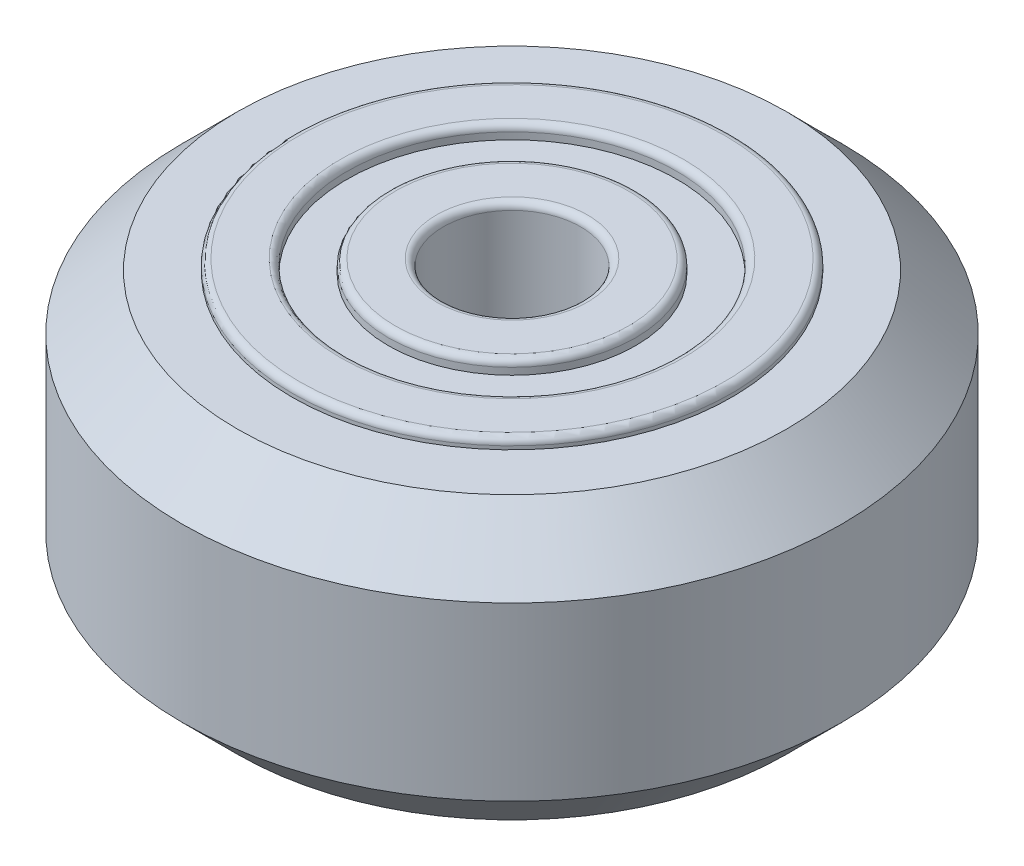
ISO-10303-21;
HEADER;
FILE_DESCRIPTION(('STEP AP214'),'2;1');
FILE_NAME('part.step','',(''),(''),'','','');
FILE_SCHEMA(('AUTOMOTIVE_DESIGN { 1 0 10303 214 1 1 1 1 }'));
ENDSEC;
DATA;
#1=APPLICATION_CONTEXT('core data for automotive mechanical design processes');
#2=APPLICATION_PROTOCOL_DEFINITION('international standard','automotive_design',2000,#1);
#3=PRODUCT_CONTEXT('',#1,'mechanical');
#4=PRODUCT('Part','Part','',(#3));
#5=PRODUCT_RELATED_PRODUCT_CATEGORY('part','',(#4));
#6=PRODUCT_DEFINITION_FORMATION('','',#4);
#7=PRODUCT_DEFINITION_CONTEXT('part definition',#1,'design');
#8=PRODUCT_DEFINITION('design','',#6,#7);
#9=PRODUCT_DEFINITION_SHAPE('','',#8);
#10=(LENGTH_UNIT() NAMED_UNIT(*) SI_UNIT(.MILLI.,.METRE.));
#11=(NAMED_UNIT(*) PLANE_ANGLE_UNIT() SI_UNIT($,.RADIAN.));
#12=(NAMED_UNIT(*) SI_UNIT($,.STERADIAN.) SOLID_ANGLE_UNIT());
#13=UNCERTAINTY_MEASURE_WITH_UNIT(LENGTH_MEASURE(1.E-05),#10,'distance_accuracy_value','');
#14=(GEOMETRIC_REPRESENTATION_CONTEXT(3) GLOBAL_UNCERTAINTY_ASSIGNED_CONTEXT((#13)) GLOBAL_UNIT_ASSIGNED_CONTEXT((#10,
#11,#12)) REPRESENTATION_CONTEXT('',''));
#15=CARTESIAN_POINT('',(0.,0.,0.));
#16=DIRECTION('',(0.,0.,1.));
#17=DIRECTION('',(1.,0.,0.));
#18=AXIS2_PLACEMENT_3D('',#15,#16,#17);
#19=CARTESIAN_POINT('',(0.,5.5,0.));
#20=DIRECTION('',(0.,-1.,0.));
#21=DIRECTION('',(0.,0.,-1.));
#22=AXIS2_PLACEMENT_3D('',#19,#20,#21);
#23=CYLINDRICAL_SURFACE('',#22,4.5);
#24=CARTESIAN_POINT('',(0.,-5.25,0.));
#25=DIRECTION('',(0.,1.,0.));
#26=DIRECTION('',(0.,0.,1.));
#27=AXIS2_PLACEMENT_3D('',#24,#25,#26);
#28=CIRCLE('',#27,4.5);
#29=CARTESIAN_POINT('',(0.,-5.25,4.5));
#30=VERTEX_POINT('',#29);
#31=EDGE_CURVE('E101',#30,#30,#28,.T.);
#32=ORIENTED_EDGE('',*,*,#31,.T.);
#33=EDGE_LOOP('',(#32));
#34=FACE_BOUND('',#33,.T.);
#35=CARTESIAN_POINT('',(0.,-5.,0.));
#36=DIRECTION('',(0.,1.,0.));
#37=DIRECTION('',(0.,0.,1.));
#38=AXIS2_PLACEMENT_3D('',#35,#36,#37);
#39=CIRCLE('',#38,4.5);
#40=CARTESIAN_POINT('',(0.,-5.,4.5));
#41=VERTEX_POINT('',#40);
#42=EDGE_CURVE('E104',#41,#41,#39,.T.);
#43=ORIENTED_EDGE('',*,*,#42,.F.);
#44=EDGE_LOOP('',(#43));
#45=FACE_BOUND('',#44,.T.);
#46=ADVANCED_FACE('F48',(#34,#45),#23,.T.);
#47=CARTESIAN_POINT('',(0.,5.5,0.));
#48=DIRECTION('',(0.,-1.,0.));
#49=DIRECTION('',(0.,0.,-1.));
#50=AXIS2_PLACEMENT_3D('',#47,#48,#49);
#51=CYLINDRICAL_SURFACE('',#50,2.5);
#52=CARTESIAN_POINT('',(0.,-5.25,0.));
#53=DIRECTION('',(0.,1.,0.));
#54=DIRECTION('',(0.,0.,1.));
#55=AXIS2_PLACEMENT_3D('',#52,#53,#54);
#56=CIRCLE('',#55,2.5);
#57=CARTESIAN_POINT('',(0.,-5.25,2.5));
#58=VERTEX_POINT('',#57);
#59=EDGE_CURVE('E89',#58,#58,#56,.F.);
#60=ORIENTED_EDGE('',*,*,#59,.T.);
#61=EDGE_LOOP('',(#60));
#62=FACE_BOUND('',#61,.T.);
#63=CARTESIAN_POINT('',(0.,5.25,0.));
#64=DIRECTION('',(0.,1.,0.));
#65=DIRECTION('',(0.,0.,1.));
#66=AXIS2_PLACEMENT_3D('',#63,#64,#65);
#67=CIRCLE('',#66,2.5);
#68=CARTESIAN_POINT('',(0.,5.25,2.5));
#69=VERTEX_POINT('',#68);
#70=EDGE_CURVE('E92',#69,#69,#67,.T.);
#71=ORIENTED_EDGE('',*,*,#70,.T.);
#72=EDGE_LOOP('',(#71));
#73=FACE_BOUND('',#72,.T.);
#74=ADVANCED_FACE('F138',(#62,#73),#51,.F.);
#75=CARTESIAN_POINT('',(0.,5.25,0.));
#76=DIRECTION('',(0.,1.,0.));
#77=DIRECTION('',(0.,0.,1.));
#78=AXIS2_PLACEMENT_3D('',#75,#76,#77);
#79=CIRCLE('',#78,4.5);
#80=CARTESIAN_POINT('',(0.,5.25,4.5));
#81=VERTEX_POINT('',#80);
#82=EDGE_CURVE('E63',#81,#81,#79,.F.);
#83=ORIENTED_EDGE('',*,*,#82,.T.);
#84=EDGE_LOOP('',(#83));
#85=FACE_BOUND('',#84,.T.);
#86=CARTESIAN_POINT('',(0.,5.,0.));
#87=DIRECTION('',(0.,1.,0.));
#88=DIRECTION('',(0.,0.,1.));
#89=AXIS2_PLACEMENT_3D('',#86,#87,#88);
#90=CIRCLE('',#89,4.5);
#91=CARTESIAN_POINT('',(0.,5.,4.5));
#92=VERTEX_POINT('',#91);
#93=EDGE_CURVE('E107',#92,#92,#90,.T.);
#94=ORIENTED_EDGE('',*,*,#93,.T.);
#95=EDGE_LOOP('',(#94));
#96=FACE_BOUND('',#95,.T.);
#97=ADVANCED_FACE('F141',(#85,#96),#23,.T.);
#98=CARTESIAN_POINT('',(0.,5.5,0.));
#99=DIRECTION('',(0.,1.,0.));
#100=DIRECTION('',(0.,0.,1.));
#101=AXIS2_PLACEMENT_3D('',#98,#99,#100);
#102=PLANE('',#101);
#103=CARTESIAN_POINT('',(0.,5.5,0.));
#104=DIRECTION('',(0.,1.,0.));
#105=DIRECTION('',(0.,0.,1.));
#106=AXIS2_PLACEMENT_3D('',#103,#104,#105);
#107=CIRCLE('',#106,4.25);
#108=CARTESIAN_POINT('',(0.,5.5,4.25));
#109=VERTEX_POINT('',#108);
#110=EDGE_CURVE('E68',#109,#109,#107,.T.);
#111=ORIENTED_EDGE('',*,*,#110,.T.);
#112=EDGE_LOOP('',(#111));
#113=FACE_BOUND('',#112,.T.);
#114=CARTESIAN_POINT('',(0.,5.5,0.));
#115=DIRECTION('',(0.,1.,0.));
#116=DIRECTION('',(0.,0.,1.));
#117=AXIS2_PLACEMENT_3D('',#114,#115,#116);
#118=CIRCLE('',#117,2.75);
#119=CARTESIAN_POINT('',(0.,5.5,2.75));
#120=VERTEX_POINT('',#119);
#121=EDGE_CURVE('E71',#120,#120,#118,.F.);
#122=ORIENTED_EDGE('',*,*,#121,.T.);
#123=EDGE_LOOP('',(#122));
#124=FACE_BOUND('',#123,.T.);
#125=ADVANCED_FACE('F132',(#113,#124),#102,.T.);
#126=CARTESIAN_POINT('',(0.,-5.5,0.));
#127=DIRECTION('',(0.,1.,0.));
#128=DIRECTION('',(0.,0.,1.));
#129=AXIS2_PLACEMENT_3D('',#126,#127,#128);
#130=PLANE('',#129);
#131=CARTESIAN_POINT('',(0.,-5.5,0.));
#132=DIRECTION('',(0.,1.,0.));
#133=DIRECTION('',(0.,0.,1.));
#134=AXIS2_PLACEMENT_3D('',#131,#132,#133);
#135=CIRCLE('',#134,4.25);
#136=CARTESIAN_POINT('',(0.,-5.5,4.25));
#137=VERTEX_POINT('',#136);
#138=EDGE_CURVE('E95',#137,#137,#135,.F.);
#139=ORIENTED_EDGE('',*,*,#138,.T.);
#140=EDGE_LOOP('',(#139));
#141=FACE_BOUND('',#140,.T.);
#142=CARTESIAN_POINT('',(0.,-5.5,0.));
#143=DIRECTION('',(0.,1.,0.));
#144=DIRECTION('',(0.,0.,1.));
#145=AXIS2_PLACEMENT_3D('',#142,#143,#144);
#146=CIRCLE('',#145,2.75);
#147=CARTESIAN_POINT('',(0.,-5.5,2.75));
#148=VERTEX_POINT('',#147);
#149=EDGE_CURVE('E98',#148,#148,#146,.T.);
#150=ORIENTED_EDGE('',*,*,#149,.T.);
#151=EDGE_LOOP('',(#150));
#152=FACE_BOUND('',#151,.T.);
#153=ADVANCED_FACE('F122',(#141,#152),#130,.F.);
#154=CARTESIAN_POINT('',(0.,5.,0.));
#155=DIRECTION('',(0.,1.,0.));
#156=DIRECTION('',(0.,0.,1.));
#157=AXIS2_PLACEMENT_3D('',#154,#155,#156);
#158=PLANE('',#157);
#159=ORIENTED_EDGE('',*,*,#93,.F.);
#160=EDGE_LOOP('',(#159));
#161=FACE_BOUND('',#160,.T.);
#162=CARTESIAN_POINT('',(0.,5.,0.));
#163=DIRECTION('',(0.,1.,0.));
#164=DIRECTION('',(0.,0.,1.));
#165=AXIS2_PLACEMENT_3D('',#162,#163,#164);
#166=CIRCLE('',#165,6.);
#167=CARTESIAN_POINT('',(0.,5.,6.));
#168=VERTEX_POINT('',#167);
#169=EDGE_CURVE('E111',#168,#168,#166,.F.);
#170=ORIENTED_EDGE('',*,*,#169,.F.);
#171=EDGE_LOOP('',(#170));
#172=FACE_BOUND('',#171,.T.);
#173=ADVANCED_FACE('F119',(#161,#172),#158,.T.);
#174=CARTESIAN_POINT('',(0.,-5.,0.));
#175=DIRECTION('',(0.,1.,0.));
#176=DIRECTION('',(0.,0.,1.));
#177=AXIS2_PLACEMENT_3D('',#174,#175,#176);
#178=PLANE('',#177);
#179=ORIENTED_EDGE('',*,*,#42,.T.);
#180=EDGE_LOOP('',(#179));
#181=FACE_BOUND('',#180,.T.);
#182=CARTESIAN_POINT('',(0.,-5.,0.));
#183=DIRECTION('',(0.,1.,0.));
#184=DIRECTION('',(0.,0.,1.));
#185=AXIS2_PLACEMENT_3D('',#182,#183,#184);
#186=CIRCLE('',#185,6.);
#187=CARTESIAN_POINT('',(0.,-5.,6.));
#188=VERTEX_POINT('',#187);
#189=EDGE_CURVE('E108',#188,#188,#186,.T.);
#190=ORIENTED_EDGE('',*,*,#189,.F.);
#191=EDGE_LOOP('',(#190));
#192=FACE_BOUND('',#191,.T.);
#193=ADVANCED_FACE('F121',(#181,#192),#178,.F.);
#194=CARTESIAN_POINT('',(0.,5.5,0.));
#195=DIRECTION('',(0.,-1.,0.));
#196=DIRECTION('',(0.,0.,-1.));
#197=AXIS2_PLACEMENT_3D('',#194,#195,#196);
#198=CYLINDRICAL_SURFACE('',#197,6.);
#199=CARTESIAN_POINT('',(0.,-5.25,0.));
#200=DIRECTION('',(0.,1.,0.));
#201=DIRECTION('',(0.,0.,1.));
#202=AXIS2_PLACEMENT_3D('',#199,#200,#201);
#203=CIRCLE('',#202,6.);
#204=CARTESIAN_POINT('',(0.,-5.25,6.));
#205=VERTEX_POINT('',#204);
#206=EDGE_CURVE('E74',#205,#205,#203,.F.);
#207=ORIENTED_EDGE('',*,*,#206,.T.);
#208=EDGE_LOOP('',(#207));
#209=FACE_BOUND('',#208,.T.);
#210=ORIENTED_EDGE('',*,*,#189,.T.);
#211=EDGE_LOOP('',(#210));
#212=FACE_BOUND('',#211,.T.);
#213=ADVANCED_FACE('F129',(#209,#212),#198,.F.);
#214=CARTESIAN_POINT('',(0.,5.25,0.));
#215=DIRECTION('',(0.,1.,0.));
#216=DIRECTION('',(0.,0.,1.));
#217=AXIS2_PLACEMENT_3D('',#214,#215,#216);
#218=CIRCLE('',#217,6.);
#219=CARTESIAN_POINT('',(0.,5.25,6.));
#220=VERTEX_POINT('',#219);
#221=EDGE_CURVE('E12',#220,#220,#218,.T.);
#222=ORIENTED_EDGE('',*,*,#221,.T.);
#223=EDGE_LOOP('',(#222));
#224=FACE_BOUND('',#223,.T.);
#225=ORIENTED_EDGE('',*,*,#169,.T.);
#226=EDGE_LOOP('',(#225));
#227=FACE_BOUND('',#226,.T.);
#228=ADVANCED_FACE('F117',(#224,#227),#198,.F.);
#229=CARTESIAN_POINT('',(0.,5.5,0.));
#230=DIRECTION('',(0.,-1.,0.));
#231=DIRECTION('',(0.,0.,-1.));
#232=AXIS2_PLACEMENT_3D('',#229,#230,#231);
#233=CYLINDRICAL_SURFACE('',#232,8.);
#234=CARTESIAN_POINT('',(0.,-5.25,0.));
#235=DIRECTION('',(0.,1.,0.));
#236=DIRECTION('',(0.,0.,1.));
#237=AXIS2_PLACEMENT_3D('',#234,#235,#236);
#238=CIRCLE('',#237,8.);
#239=CARTESIAN_POINT('',(0.,-5.25,8.));
#240=VERTEX_POINT('',#239);
#241=EDGE_CURVE('E83',#240,#240,#238,.T.);
#242=ORIENTED_EDGE('',*,*,#241,.T.);
#243=EDGE_LOOP('',(#242));
#244=FACE_BOUND('',#243,.T.);
#245=CARTESIAN_POINT('',(0.,5.25,0.));
#246=DIRECTION('',(0.,1.,0.));
#247=DIRECTION('',(0.,0.,1.));
#248=AXIS2_PLACEMENT_3D('',#245,#246,#247);
#249=CIRCLE('',#248,8.);
#250=CARTESIAN_POINT('',(0.,5.25,8.));
#251=VERTEX_POINT('',#250);
#252=EDGE_CURVE('E86',#251,#251,#249,.F.);
#253=ORIENTED_EDGE('',*,*,#252,.T.);
#254=EDGE_LOOP('',(#253));
#255=FACE_BOUND('',#254,.T.);
#256=ADVANCED_FACE('F209',(#244,#255),#233,.T.);
#257=CARTESIAN_POINT('',(0.,5.5,0.));
#258=DIRECTION('',(0.,1.,0.));
#259=DIRECTION('',(0.,0.,1.));
#260=AXIS2_PLACEMENT_3D('',#257,#258,#259);
#261=PLANE('',#260);
#262=CARTESIAN_POINT('',(0.,5.5,0.));
#263=DIRECTION('',(0.,1.,0.));
#264=DIRECTION('',(0.,0.,1.));
#265=AXIS2_PLACEMENT_3D('',#262,#263,#264);
#266=CIRCLE('',#265,7.75);
#267=CARTESIAN_POINT('',(0.,5.5,7.75));
#268=VERTEX_POINT('',#267);
#269=EDGE_CURVE('E55',#268,#268,#266,.T.);
#270=ORIENTED_EDGE('',*,*,#269,.T.);
#271=EDGE_LOOP('',(#270));
#272=FACE_BOUND('',#271,.T.);
#273=CARTESIAN_POINT('',(0.,5.5,0.));
#274=DIRECTION('',(0.,1.,0.));
#275=DIRECTION('',(0.,0.,1.));
#276=AXIS2_PLACEMENT_3D('',#273,#274,#275);
#277=CIRCLE('',#276,6.25);
#278=CARTESIAN_POINT('',(0.,5.5,6.25));
#279=VERTEX_POINT('',#278);
#280=EDGE_CURVE('E59',#279,#279,#277,.F.);
#281=ORIENTED_EDGE('',*,*,#280,.T.);
#282=EDGE_LOOP('',(#281));
#283=FACE_BOUND('',#282,.T.);
#284=ADVANCED_FACE('F197',(#272,#283),#261,.T.);
#285=CARTESIAN_POINT('',(0.,-5.5,0.));
#286=DIRECTION('',(0.,1.,0.));
#287=DIRECTION('',(0.,0.,1.));
#288=AXIS2_PLACEMENT_3D('',#285,#286,#287);
#289=PLANE('',#288);
#290=CARTESIAN_POINT('',(0.,-5.5,0.));
#291=DIRECTION('',(0.,1.,0.));
#292=DIRECTION('',(0.,0.,1.));
#293=AXIS2_PLACEMENT_3D('',#290,#291,#292);
#294=CIRCLE('',#293,7.75);
#295=CARTESIAN_POINT('',(0.,-5.5,7.75));
#296=VERTEX_POINT('',#295);
#297=EDGE_CURVE('E77',#296,#296,#294,.F.);
#298=ORIENTED_EDGE('',*,*,#297,.T.);
#299=EDGE_LOOP('',(#298));
#300=FACE_BOUND('',#299,.T.);
#301=CARTESIAN_POINT('',(0.,-5.5,0.));
#302=DIRECTION('',(0.,1.,0.));
#303=DIRECTION('',(0.,0.,1.));
#304=AXIS2_PLACEMENT_3D('',#301,#302,#303);
#305=CIRCLE('',#304,6.25);
#306=CARTESIAN_POINT('',(0.,-5.5,6.25));
#307=VERTEX_POINT('',#306);
#308=EDGE_CURVE('E80',#307,#307,#305,.T.);
#309=ORIENTED_EDGE('',*,*,#308,.T.);
#310=EDGE_LOOP('',(#309));
#311=FACE_BOUND('',#310,.T.);
#312=ADVANCED_FACE('F192',(#300,#311),#289,.F.);
#313=CARTESIAN_POINT('',(0.,-5.25,0.));
#314=DIRECTION('',(0.,1.,0.));
#315=DIRECTION('',(0.,0.,1.));
#316=AXIS2_PLACEMENT_3D('',#313,#314,#315);
#317=TOROIDAL_SURFACE('',#316,4.25,0.25);
#318=ORIENTED_EDGE('',*,*,#138,.F.);
#319=EDGE_LOOP('',(#318));
#320=FACE_BOUND('',#319,.T.);
#321=ORIENTED_EDGE('',*,*,#31,.F.);
#322=EDGE_LOOP('',(#321));
#323=FACE_BOUND('',#322,.T.);
#324=ADVANCED_FACE('F189',(#320,#323),#317,.T.);
#325=CARTESIAN_POINT('',(0.,-5.25,0.));
#326=DIRECTION('',(0.,1.,0.));
#327=DIRECTION('',(0.,0.,1.));
#328=AXIS2_PLACEMENT_3D('',#325,#326,#327);
#329=TOROIDAL_SURFACE('',#328,2.75,0.25);
#330=ORIENTED_EDGE('',*,*,#59,.F.);
#331=EDGE_LOOP('',(#330));
#332=FACE_BOUND('',#331,.T.);
#333=ORIENTED_EDGE('',*,*,#149,.F.);
#334=EDGE_LOOP('',(#333));
#335=FACE_BOUND('',#334,.T.);
#336=ADVANCED_FACE('F185',(#332,#335),#329,.T.);
#337=CARTESIAN_POINT('',(0.,-5.25,0.));
#338=DIRECTION('',(0.,1.,0.));
#339=DIRECTION('',(0.,0.,1.));
#340=AXIS2_PLACEMENT_3D('',#337,#338,#339);
#341=TOROIDAL_SURFACE('',#340,7.75,0.25);
#342=ORIENTED_EDGE('',*,*,#297,.F.);
#343=EDGE_LOOP('',(#342));
#344=FACE_BOUND('',#343,.T.);
#345=ORIENTED_EDGE('',*,*,#241,.F.);
#346=EDGE_LOOP('',(#345));
#347=FACE_BOUND('',#346,.T.);
#348=ADVANCED_FACE('F181',(#344,#347),#341,.T.);
#349=CARTESIAN_POINT('',(0.,-5.25,0.));
#350=DIRECTION('',(0.,1.,0.));
#351=DIRECTION('',(0.,0.,1.));
#352=AXIS2_PLACEMENT_3D('',#349,#350,#351);
#353=TOROIDAL_SURFACE('',#352,6.25,0.25);
#354=ORIENTED_EDGE('',*,*,#206,.F.);
#355=EDGE_LOOP('',(#354));
#356=FACE_BOUND('',#355,.T.);
#357=ORIENTED_EDGE('',*,*,#308,.F.);
#358=EDGE_LOOP('',(#357));
#359=FACE_BOUND('',#358,.T.);
#360=ADVANCED_FACE('F162',(#356,#359),#353,.T.);
#361=CARTESIAN_POINT('',(0.,5.25,0.));
#362=DIRECTION('',(0.,1.,0.));
#363=DIRECTION('',(0.,0.,1.));
#364=AXIS2_PLACEMENT_3D('',#361,#362,#363);
#365=TOROIDAL_SURFACE('',#364,4.25,0.25);
#366=ORIENTED_EDGE('',*,*,#82,.F.);
#367=EDGE_LOOP('',(#366));
#368=FACE_BOUND('',#367,.T.);
#369=ORIENTED_EDGE('',*,*,#110,.F.);
#370=EDGE_LOOP('',(#369));
#371=FACE_BOUND('',#370,.T.);
#372=ADVANCED_FACE('F158',(#368,#371),#365,.T.);
#373=CARTESIAN_POINT('',(0.,5.25,0.));
#374=DIRECTION('',(0.,1.,0.));
#375=DIRECTION('',(0.,0.,1.));
#376=AXIS2_PLACEMENT_3D('',#373,#374,#375);
#377=TOROIDAL_SURFACE('',#376,2.75,0.25);
#378=ORIENTED_EDGE('',*,*,#121,.F.);
#379=EDGE_LOOP('',(#378));
#380=FACE_BOUND('',#379,.T.);
#381=ORIENTED_EDGE('',*,*,#70,.F.);
#382=EDGE_LOOP('',(#381));
#383=FACE_BOUND('',#382,.T.);
#384=ADVANCED_FACE('F161',(#380,#383),#377,.T.);
#385=CARTESIAN_POINT('',(0.,5.25,0.));
#386=DIRECTION('',(0.,1.,0.));
#387=DIRECTION('',(0.,0.,1.));
#388=AXIS2_PLACEMENT_3D('',#385,#386,#387);
#389=TOROIDAL_SURFACE('',#388,7.75,0.25);
#390=ORIENTED_EDGE('',*,*,#252,.F.);
#391=EDGE_LOOP('',(#390));
#392=FACE_BOUND('',#391,.T.);
#393=ORIENTED_EDGE('',*,*,#269,.F.);
#394=EDGE_LOOP('',(#393));
#395=FACE_BOUND('',#394,.T.);
#396=ADVANCED_FACE('F170',(#392,#395),#389,.T.);
#397=CARTESIAN_POINT('',(0.,5.25,0.));
#398=DIRECTION('',(0.,1.,0.));
#399=DIRECTION('',(0.,0.,1.));
#400=AXIS2_PLACEMENT_3D('',#397,#398,#399);
#401=TOROIDAL_SURFACE('',#400,6.25,0.25);
#402=ORIENTED_EDGE('',*,*,#280,.F.);
#403=EDGE_LOOP('',(#402));
#404=FACE_BOUND('',#403,.T.);
#405=ORIENTED_EDGE('',*,*,#221,.F.);
#406=EDGE_LOOP('',(#405));
#407=FACE_BOUND('',#406,.T.);
#408=ADVANCED_FACE('F50',(#404,#407),#401,.T.);
#409=CLOSED_SHELL('',(#46,#74,#97,#125,#153,#173,#193,#213,#228,#256,#284,#312,#324,#336,#348,
#360,#372,#384,#396,#408));
#410=MANIFOLD_SOLID_BREP('B2',#409);
#411=CARTESIAN_POINT('',(0.,5.125,0.));
#412=DIRECTION('',(0.,-1.,0.));
#413=DIRECTION('',(0.,0.,-1.));
#414=AXIS2_PLACEMENT_3D('',#411,#412,#413);
#415=CYLINDRICAL_SURFACE('',#414,8.);
#416=CARTESIAN_POINT('',(0.,5.125,0.));
#417=DIRECTION('',(0.,1.,0.));
#418=DIRECTION('',(0.,0.,1.));
#419=AXIS2_PLACEMENT_3D('',#416,#417,#418);
#420=CIRCLE('',#419,8.);
#421=CARTESIAN_POINT('',(0.,5.125,8.));
#422=VERTEX_POINT('',#421);
#423=EDGE_CURVE('E367',#422,#422,#420,.T.);
#424=ORIENTED_EDGE('',*,*,#423,.T.);
#425=EDGE_LOOP('',(#424));
#426=FACE_BOUND('',#425,.T.);
#427=CARTESIAN_POINT('',(0.,-5.125,0.));
#428=DIRECTION('',(0.,1.,0.));
#429=DIRECTION('',(0.,0.,1.));
#430=AXIS2_PLACEMENT_3D('',#427,#428,#429);
#431=CIRCLE('',#430,8.);
#432=CARTESIAN_POINT('',(0.,-5.125,8.));
#433=VERTEX_POINT('',#432);
#434=EDGE_CURVE('E368',#433,#433,#431,.T.);
#435=ORIENTED_EDGE('',*,*,#434,.F.);
#436=EDGE_LOOP('',(#435));
#437=FACE_BOUND('',#436,.T.);
#438=ADVANCED_FACE('F347',(#426,#437),#415,.F.);
#439=CARTESIAN_POINT('',(0.,5.125,0.));
#440=DIRECTION('',(0.,-1.,0.));
#441=DIRECTION('',(0.,0.,-1.));
#442=AXIS2_PLACEMENT_3D('',#439,#440,#441);
#443=CYLINDRICAL_SURFACE('',#442,12.);
#444=CARTESIAN_POINT('',(0.,-3.125,0.));
#445=DIRECTION('',(0.,1.,0.));
#446=DIRECTION('',(0.,0.,1.));
#447=AXIS2_PLACEMENT_3D('',#444,#445,#446);
#448=CIRCLE('',#447,12.);
#449=CARTESIAN_POINT('',(0.,-3.125,12.));
#450=VERTEX_POINT('',#449);
#451=EDGE_CURVE('E358',#450,#450,#448,.T.);
#452=ORIENTED_EDGE('',*,*,#451,.T.);
#453=EDGE_LOOP('',(#452));
#454=FACE_BOUND('',#453,.T.);
#455=CARTESIAN_POINT('',(0.,3.125,0.));
#456=DIRECTION('',(0.,1.,0.));
#457=DIRECTION('',(0.,0.,1.));
#458=AXIS2_PLACEMENT_3D('',#455,#456,#457);
#459=CIRCLE('',#458,12.);
#460=CARTESIAN_POINT('',(0.,3.125,12.));
#461=VERTEX_POINT('',#460);
#462=EDGE_CURVE('E362',#461,#461,#459,.F.);
#463=ORIENTED_EDGE('',*,*,#462,.T.);
#464=EDGE_LOOP('',(#463));
#465=FACE_BOUND('',#464,.T.);
#466=ADVANCED_FACE('F379',(#454,#465),#443,.T.);
#467=CARTESIAN_POINT('',(0.,5.125,0.));
#468=DIRECTION('',(0.,1.,0.));
#469=DIRECTION('',(0.,0.,1.));
#470=AXIS2_PLACEMENT_3D('',#467,#468,#469);
#471=PLANE('',#470);
#472=CARTESIAN_POINT('',(0.,5.125,0.));
#473=DIRECTION('',(0.,1.,0.));
#474=DIRECTION('',(0.,0.,1.));
#475=AXIS2_PLACEMENT_3D('',#472,#473,#474);
#476=CIRCLE('',#475,10.);
#477=CARTESIAN_POINT('',(0.,5.125,10.));
#478=VERTEX_POINT('',#477);
#479=EDGE_CURVE('E47',#478,#478,#476,.T.);
#480=ORIENTED_EDGE('',*,*,#479,.T.);
#481=EDGE_LOOP('',(#480));
#482=FACE_BOUND('',#481,.T.);
#483=ORIENTED_EDGE('',*,*,#423,.F.);
#484=EDGE_LOOP('',(#483));
#485=FACE_BOUND('',#484,.T.);
#486=ADVANCED_FACE('F376',(#482,#485),#471,.T.);
#487=CARTESIAN_POINT('',(0.,-5.125,0.));
#488=DIRECTION('',(0.,1.,0.));
#489=DIRECTION('',(0.,0.,1.));
#490=AXIS2_PLACEMENT_3D('',#487,#488,#489);
#491=PLANE('',#490);
#492=CARTESIAN_POINT('',(0.,-5.125,0.));
#493=DIRECTION('',(0.,1.,0.));
#494=DIRECTION('',(0.,0.,1.));
#495=AXIS2_PLACEMENT_3D('',#492,#493,#494);
#496=CIRCLE('',#495,9.99999999999999);
#497=CARTESIAN_POINT('',(0.,-5.125,9.99999999999999));
#498=VERTEX_POINT('',#497);
#499=EDGE_CURVE('E354',#498,#498,#496,.F.);
#500=ORIENTED_EDGE('',*,*,#499,.T.);
#501=EDGE_LOOP('',(#500));
#502=FACE_BOUND('',#501,.T.);
#503=ORIENTED_EDGE('',*,*,#434,.T.);
#504=EDGE_LOOP('',(#503));
#505=FACE_BOUND('',#504,.T.);
#506=ADVANCED_FACE('F378',(#502,#505),#491,.F.);
#507=CARTESIAN_POINT('',(0.,-3.125,0.));
#508=DIRECTION('',(0.,1.,0.));
#509=DIRECTION('',(0.,0.,1.));
#510=AXIS2_PLACEMENT_3D('',#507,#508,#509);
#511=CONICAL_SURFACE('',#510,12.,0.78539816339745);
#512=ORIENTED_EDGE('',*,*,#499,.F.);
#513=EDGE_LOOP('',(#512));
#514=FACE_BOUND('',#513,.T.);
#515=ORIENTED_EDGE('',*,*,#451,.F.);
#516=EDGE_LOOP('',(#515));
#517=FACE_BOUND('',#516,.T.);
#518=ADVANCED_FACE('F385',(#514,#517),#511,.T.);
#519=CARTESIAN_POINT('',(0.,5.125,0.));
#520=DIRECTION('',(0.,-1.,0.));
#521=DIRECTION('',(0.,0.,-1.));
#522=AXIS2_PLACEMENT_3D('',#519,#520,#521);
#523=CONICAL_SURFACE('',#522,10.,0.785398163397446);
#524=ORIENTED_EDGE('',*,*,#462,.F.);
#525=EDGE_LOOP('',(#524));
#526=FACE_BOUND('',#525,.T.);
#527=ORIENTED_EDGE('',*,*,#479,.F.);
#528=EDGE_LOOP('',(#527));
#529=FACE_BOUND('',#528,.T.);
#530=ADVANCED_FACE('F349',(#526,#529),#523,.T.);
#531=CLOSED_SHELL('',(#438,#466,#486,#506,#518,#530));
#532=MANIFOLD_SOLID_BREP('B7',#531);
#533=ADVANCED_BREP_SHAPE_REPRESENTATION('',(#18,#410,#532),#14);
#534=SHAPE_DEFINITION_REPRESENTATION(#9,#533);
ENDSEC;
END-ISO-10303-21;
